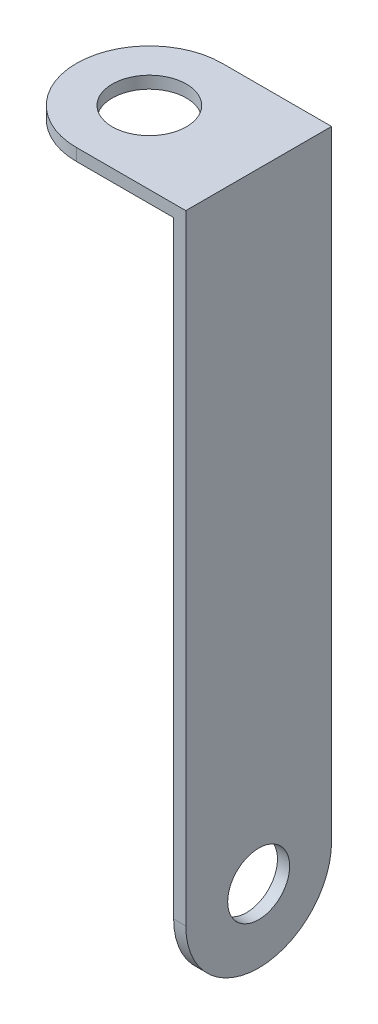
ISO-10303-21;
HEADER;
FILE_DESCRIPTION(('STEP AP214'),'2;1');
FILE_NAME('part.step','',(''),(''),'','','');
FILE_SCHEMA(('AUTOMOTIVE_DESIGN { 1 0 10303 214 1 1 1 1 }'));
ENDSEC;
DATA;
#1=APPLICATION_CONTEXT('core data for automotive mechanical design processes');
#2=APPLICATION_PROTOCOL_DEFINITION('international standard','automotive_design',2000,#1);
#3=PRODUCT_CONTEXT('',#1,'mechanical');
#4=PRODUCT('Part','Part','',(#3));
#5=PRODUCT_RELATED_PRODUCT_CATEGORY('part','',(#4));
#6=PRODUCT_DEFINITION_FORMATION('','',#4);
#7=PRODUCT_DEFINITION_CONTEXT('part definition',#1,'design');
#8=PRODUCT_DEFINITION('design','',#6,#7);
#9=PRODUCT_DEFINITION_SHAPE('','',#8);
#10=(LENGTH_UNIT() NAMED_UNIT(*) SI_UNIT(.MILLI.,.METRE.));
#11=(NAMED_UNIT(*) PLANE_ANGLE_UNIT() SI_UNIT($,.RADIAN.));
#12=(NAMED_UNIT(*) SI_UNIT($,.STERADIAN.) SOLID_ANGLE_UNIT());
#13=UNCERTAINTY_MEASURE_WITH_UNIT(LENGTH_MEASURE(1.E-05),#10,'distance_accuracy_value','');
#14=(GEOMETRIC_REPRESENTATION_CONTEXT(3) GLOBAL_UNCERTAINTY_ASSIGNED_CONTEXT((#13)) GLOBAL_UNIT_ASSIGNED_CONTEXT((#10,
#11,#12)) REPRESENTATION_CONTEXT('',''));
#15=CARTESIAN_POINT('',(0.,0.,0.));
#16=DIRECTION('',(0.,0.,1.));
#17=DIRECTION('',(1.,0.,0.));
#18=AXIS2_PLACEMENT_3D('',#15,#16,#17);
#19=CARTESIAN_POINT('',(0.,1.,0.));
#20=DIRECTION('',(0.,1.,0.));
#21=DIRECTION('',(0.,0.,1.));
#22=AXIS2_PLACEMENT_3D('',#19,#20,#21);
#23=PLANE('',#22);
#24=CARTESIAN_POINT('',(0.,1.,0.));
#25=DIRECTION('',(0.,1.,0.));
#26=DIRECTION('',(0.,0.,1.));
#27=AXIS2_PLACEMENT_3D('',#24,#25,#26);
#28=CIRCLE('',#27,6.);
#29=CARTESIAN_POINT('',(0.,1.,-6.));
#30=VERTEX_POINT('',#29);
#31=CARTESIAN_POINT('',(0.,1.,6.));
#32=VERTEX_POINT('',#31);
#33=EDGE_CURVE('E131',#30,#32,#28,.T.);
#34=ORIENTED_EDGE('',*,*,#33,.T.);
#35=DIRECTION('',(1.,0.,0.));
#36=VECTOR('',#35,1.);
#37=CARTESIAN_POINT('',(9.,1.,6.));
#38=LINE('',#37,#36);
#39=CARTESIAN_POINT('',(9.,1.,6.));
#40=VERTEX_POINT('',#39);
#41=EDGE_CURVE('E79',#32,#40,#38,.T.);
#42=ORIENTED_EDGE('',*,*,#41,.T.);
#43=DIRECTION('',(0.,0.,-1.));
#44=VECTOR('',#43,1.);
#45=CARTESIAN_POINT('',(9.,1.,-6.));
#46=LINE('',#45,#44);
#47=CARTESIAN_POINT('',(9.,1.,-6.));
#48=VERTEX_POINT('',#47);
#49=EDGE_CURVE('E134',#40,#48,#46,.T.);
#50=ORIENTED_EDGE('',*,*,#49,.T.);
#51=DIRECTION('',(-1.,0.,0.));
#52=VECTOR('',#51,1.);
#53=CARTESIAN_POINT('',(0.,1.,-6.));
#54=LINE('',#53,#52);
#55=EDGE_CURVE('E57',#48,#30,#54,.T.);
#56=ORIENTED_EDGE('',*,*,#55,.T.);
#57=EDGE_LOOP('',(#34,#42,#50,#56));
#58=FACE_BOUND('',#57,.T.);
#59=CARTESIAN_POINT('',(0.,1.,0.));
#60=DIRECTION('',(0.,1.,0.));
#61=DIRECTION('',(0.,0.,1.));
#62=AXIS2_PLACEMENT_3D('',#59,#60,#61);
#63=CIRCLE('',#62,3.05);
#64=CARTESIAN_POINT('',(0.,1.,3.05));
#65=VERTEX_POINT('',#64);
#66=EDGE_CURVE('E125',#65,#65,#63,.T.);
#67=ORIENTED_EDGE('',*,*,#66,.F.);
#68=EDGE_LOOP('',(#67));
#69=FACE_BOUND('',#68,.T.);
#70=ADVANCED_FACE('F33',(#58,#69),#23,.T.);
#71=CARTESIAN_POINT('',(0.,0.,0.));
#72=DIRECTION('',(0.,1.,0.));
#73=DIRECTION('',(0.,0.,1.));
#74=AXIS2_PLACEMENT_3D('',#71,#72,#73);
#75=PLANE('',#74);
#76=DIRECTION('',(-1.,0.,0.));
#77=VECTOR('',#76,1.);
#78=CARTESIAN_POINT('',(0.,0.,-6.));
#79=LINE('',#78,#77);
#80=CARTESIAN_POINT('',(8.,0.,-6.));
#81=VERTEX_POINT('',#80);
#82=CARTESIAN_POINT('',(0.,0.,-6.));
#83=VERTEX_POINT('',#82);
#84=EDGE_CURVE('E72',#81,#83,#79,.T.);
#85=ORIENTED_EDGE('',*,*,#84,.F.);
#86=DIRECTION('',(0.,0.,1.));
#87=VECTOR('',#86,1.);
#88=CARTESIAN_POINT('',(8.,0.,-6.));
#89=LINE('',#88,#87);
#90=CARTESIAN_POINT('',(8.,0.,6.));
#91=VERTEX_POINT('',#90);
#92=EDGE_CURVE('E109',#81,#91,#89,.T.);
#93=ORIENTED_EDGE('',*,*,#92,.T.);
#94=DIRECTION('',(1.,0.,0.));
#95=VECTOR('',#94,1.);
#96=CARTESIAN_POINT('',(9.,0.,6.));
#97=LINE('',#96,#95);
#98=CARTESIAN_POINT('',(0.,0.,6.));
#99=VERTEX_POINT('',#98);
#100=EDGE_CURVE('E113',#99,#91,#97,.T.);
#101=ORIENTED_EDGE('',*,*,#100,.F.);
#102=CARTESIAN_POINT('',(0.,0.,0.));
#103=DIRECTION('',(0.,1.,0.));
#104=DIRECTION('',(0.,0.,1.));
#105=AXIS2_PLACEMENT_3D('',#102,#103,#104);
#106=CIRCLE('',#105,6.);
#107=EDGE_CURVE('E128',#83,#99,#106,.T.);
#108=ORIENTED_EDGE('',*,*,#107,.F.);
#109=EDGE_LOOP('',(#85,#93,#101,#108));
#110=FACE_BOUND('',#109,.T.);
#111=CARTESIAN_POINT('',(0.,0.,0.));
#112=DIRECTION('',(0.,1.,0.));
#113=DIRECTION('',(0.,0.,1.));
#114=AXIS2_PLACEMENT_3D('',#111,#112,#113);
#115=CIRCLE('',#114,3.05);
#116=CARTESIAN_POINT('',(0.,0.,3.05));
#117=VERTEX_POINT('',#116);
#118=EDGE_CURVE('E123',#117,#117,#115,.T.);
#119=ORIENTED_EDGE('',*,*,#118,.T.);
#120=EDGE_LOOP('',(#119));
#121=FACE_BOUND('',#120,.T.);
#122=ADVANCED_FACE('F155',(#110,#121),#75,.F.);
#123=CARTESIAN_POINT('',(0.,1.,0.));
#124=DIRECTION('',(0.,-1.,0.));
#125=DIRECTION('',(0.,0.,-1.));
#126=AXIS2_PLACEMENT_3D('',#123,#124,#125);
#127=CYLINDRICAL_SURFACE('',#126,6.);
#128=ORIENTED_EDGE('',*,*,#107,.T.);
#129=DIRECTION('',(0.,-1.,0.));
#130=VECTOR('',#129,1.);
#131=CARTESIAN_POINT('',(0.,1.,6.));
#132=LINE('',#131,#130);
#133=EDGE_CURVE('E11',#32,#99,#132,.T.);
#134=ORIENTED_EDGE('',*,*,#133,.F.);
#135=ORIENTED_EDGE('',*,*,#33,.F.);
#136=DIRECTION('',(0.,-1.,0.));
#137=VECTOR('',#136,1.);
#138=CARTESIAN_POINT('',(0.,1.,-6.));
#139=LINE('',#138,#137);
#140=EDGE_CURVE('E137',#30,#83,#139,.T.);
#141=ORIENTED_EDGE('',*,*,#140,.T.);
#142=EDGE_LOOP('',(#128,#134,#135,#141));
#143=FACE_BOUND('',#142,.T.);
#144=ADVANCED_FACE('F35',(#143),#127,.T.);
#145=CARTESIAN_POINT('',(9.,1.,6.));
#146=DIRECTION('',(0.,0.,-1.));
#147=DIRECTION('',(-1.,0.,0.));
#148=AXIS2_PLACEMENT_3D('',#145,#146,#147);
#149=PLANE('',#148);
#150=ORIENTED_EDGE('',*,*,#100,.T.);
#151=DIRECTION('',(0.,-1.,0.));
#152=VECTOR('',#151,1.);
#153=CARTESIAN_POINT('',(8.,0.999999999999999,6.));
#154=LINE('',#153,#152);
#155=CARTESIAN_POINT('',(8.,-50.,5.99999999999999));
#156=VERTEX_POINT('',#155);
#157=EDGE_CURVE('E48',#91,#156,#154,.T.);
#158=ORIENTED_EDGE('',*,*,#157,.T.);
#159=DIRECTION('',(1.,0.,0.));
#160=VECTOR('',#159,1.);
#161=CARTESIAN_POINT('',(8.,-50.,5.99999999999999));
#162=LINE('',#161,#160);
#163=CARTESIAN_POINT('',(9.,-50.,5.99999999999999));
#164=VERTEX_POINT('',#163);
#165=EDGE_CURVE('E104',#156,#164,#162,.T.);
#166=ORIENTED_EDGE('',*,*,#165,.T.);
#167=DIRECTION('',(0.,-1.,0.));
#168=VECTOR('',#167,1.);
#169=CARTESIAN_POINT('',(9.,1.,6.));
#170=LINE('',#169,#168);
#171=EDGE_CURVE('E41',#40,#164,#170,.T.);
#172=ORIENTED_EDGE('',*,*,#171,.F.);
#173=ORIENTED_EDGE('',*,*,#41,.F.);
#174=ORIENTED_EDGE('',*,*,#133,.T.);
#175=EDGE_LOOP('',(#150,#158,#166,#172,#173,#174));
#176=FACE_BOUND('',#175,.T.);
#177=ADVANCED_FACE('F112',(#176),#149,.F.);
#178=CARTESIAN_POINT('',(9.,1.,-6.));
#179=DIRECTION('',(-1.,0.,0.));
#180=DIRECTION('',(0.,0.,1.));
#181=AXIS2_PLACEMENT_3D('',#178,#179,#180);
#182=PLANE('',#181);
#183=ORIENTED_EDGE('',*,*,#171,.T.);
#184=CARTESIAN_POINT('',(9.,-50.,0.));
#185=DIRECTION('',(-1.,0.,0.));
#186=DIRECTION('',(0.,0.,1.));
#187=AXIS2_PLACEMENT_3D('',#184,#185,#186);
#188=CIRCLE('',#187,6.);
#189=CARTESIAN_POINT('',(9.,-50.,-6.00000000000001));
#190=VERTEX_POINT('',#189);
#191=EDGE_CURVE('E107',#190,#164,#188,.T.);
#192=ORIENTED_EDGE('',*,*,#191,.F.);
#193=DIRECTION('',(0.,-1.,0.));
#194=VECTOR('',#193,1.);
#195=CARTESIAN_POINT('',(9.,1.,-6.));
#196=LINE('',#195,#194);
#197=EDGE_CURVE('E143',#48,#190,#196,.T.);
#198=ORIENTED_EDGE('',*,*,#197,.F.);
#199=ORIENTED_EDGE('',*,*,#49,.F.);
#200=EDGE_LOOP('',(#183,#192,#198,#199));
#201=FACE_BOUND('',#200,.T.);
#202=CARTESIAN_POINT('',(9.,-50.,0.));
#203=DIRECTION('',(-1.,0.,0.));
#204=DIRECTION('',(0.,0.,1.));
#205=AXIS2_PLACEMENT_3D('',#202,#203,#204);
#206=CIRCLE('',#205,2.55);
#207=CARTESIAN_POINT('',(9.,-50.,2.55));
#208=VERTEX_POINT('',#207);
#209=EDGE_CURVE('E118',#208,#208,#206,.T.);
#210=ORIENTED_EDGE('',*,*,#209,.T.);
#211=EDGE_LOOP('',(#210));
#212=FACE_BOUND('',#211,.T.);
#213=ADVANCED_FACE('F146',(#201,#212),#182,.F.);
#214=CARTESIAN_POINT('',(0.,1.,-6.));
#215=DIRECTION('',(0.,0.,1.));
#216=DIRECTION('',(1.,0.,0.));
#217=AXIS2_PLACEMENT_3D('',#214,#215,#216);
#218=PLANE('',#217);
#219=ORIENTED_EDGE('',*,*,#197,.T.);
#220=DIRECTION('',(1.,0.,0.));
#221=VECTOR('',#220,1.);
#222=CARTESIAN_POINT('',(8.,-50.,-6.00000000000001));
#223=LINE('',#222,#221);
#224=CARTESIAN_POINT('',(8.,-50.,-6.00000000000001));
#225=VERTEX_POINT('',#224);
#226=EDGE_CURVE('E108',#225,#190,#223,.T.);
#227=ORIENTED_EDGE('',*,*,#226,.F.);
#228=DIRECTION('',(0.,1.,0.));
#229=VECTOR('',#228,1.);
#230=CARTESIAN_POINT('',(8.,1.,-6.));
#231=LINE('',#230,#229);
#232=EDGE_CURVE('E98',#225,#81,#231,.T.);
#233=ORIENTED_EDGE('',*,*,#232,.T.);
#234=ORIENTED_EDGE('',*,*,#84,.T.);
#235=ORIENTED_EDGE('',*,*,#140,.F.);
#236=ORIENTED_EDGE('',*,*,#55,.F.);
#237=EDGE_LOOP('',(#219,#227,#233,#234,#235,#236));
#238=FACE_BOUND('',#237,.T.);
#239=ADVANCED_FACE('F163',(#238),#218,.F.);
#240=CARTESIAN_POINT('',(0.,1.,0.));
#241=DIRECTION('',(0.,-1.,0.));
#242=DIRECTION('',(0.,0.,-1.));
#243=AXIS2_PLACEMENT_3D('',#240,#241,#242);
#244=CYLINDRICAL_SURFACE('',#243,3.05);
#245=ORIENTED_EDGE('',*,*,#66,.T.);
#246=EDGE_LOOP('',(#245));
#247=FACE_BOUND('',#246,.T.);
#248=ORIENTED_EDGE('',*,*,#118,.F.);
#249=EDGE_LOOP('',(#248));
#250=FACE_BOUND('',#249,.T.);
#251=ADVANCED_FACE('F161',(#247,#250),#244,.F.);
#252=CARTESIAN_POINT('',(8.,-50.,0.));
#253=DIRECTION('',(-1.,0.,0.));
#254=DIRECTION('',(0.,0.,1.));
#255=AXIS2_PLACEMENT_3D('',#252,#253,#254);
#256=PLANE('',#255);
#257=ORIENTED_EDGE('',*,*,#157,.F.);
#258=ORIENTED_EDGE('',*,*,#92,.F.);
#259=ORIENTED_EDGE('',*,*,#232,.F.);
#260=CARTESIAN_POINT('',(8.,-50.,0.));
#261=DIRECTION('',(-1.,0.,0.));
#262=DIRECTION('',(0.,0.,1.));
#263=AXIS2_PLACEMENT_3D('',#260,#261,#262);
#264=CIRCLE('',#263,6.);
#265=EDGE_CURVE('E94',#225,#156,#264,.T.);
#266=ORIENTED_EDGE('',*,*,#265,.T.);
#267=EDGE_LOOP('',(#257,#258,#259,#266));
#268=FACE_BOUND('',#267,.T.);
#269=CARTESIAN_POINT('',(8.,-50.,0.));
#270=DIRECTION('',(-1.,0.,0.));
#271=DIRECTION('',(0.,0.,1.));
#272=AXIS2_PLACEMENT_3D('',#269,#270,#271);
#273=CIRCLE('',#272,2.55);
#274=CARTESIAN_POINT('',(8.,-50.,2.55));
#275=VERTEX_POINT('',#274);
#276=EDGE_CURVE('E115',#275,#275,#273,.T.);
#277=ORIENTED_EDGE('',*,*,#276,.F.);
#278=EDGE_LOOP('',(#277));
#279=FACE_BOUND('',#278,.T.);
#280=ADVANCED_FACE('F96',(#268,#279),#256,.T.);
#281=CARTESIAN_POINT('',(8.,-50.,0.));
#282=DIRECTION('',(1.,0.,0.));
#283=DIRECTION('',(0.,0.,-1.));
#284=AXIS2_PLACEMENT_3D('',#281,#282,#283);
#285=CYLINDRICAL_SURFACE('',#284,6.);
#286=ORIENTED_EDGE('',*,*,#191,.T.);
#287=ORIENTED_EDGE('',*,*,#165,.F.);
#288=ORIENTED_EDGE('',*,*,#265,.F.);
#289=ORIENTED_EDGE('',*,*,#226,.T.);
#290=EDGE_LOOP('',(#286,#287,#288,#289));
#291=FACE_BOUND('',#290,.T.);
#292=ADVANCED_FACE('F105',(#291),#285,.T.);
#293=CARTESIAN_POINT('',(8.,-50.,0.));
#294=DIRECTION('',(1.,0.,0.));
#295=DIRECTION('',(0.,0.,-1.));
#296=AXIS2_PLACEMENT_3D('',#293,#294,#295);
#297=CYLINDRICAL_SURFACE('',#296,2.55);
#298=ORIENTED_EDGE('',*,*,#276,.T.);
#299=EDGE_LOOP('',(#298));
#300=FACE_BOUND('',#299,.T.);
#301=ORIENTED_EDGE('',*,*,#209,.F.);
#302=EDGE_LOOP('',(#301));
#303=FACE_BOUND('',#302,.T.);
#304=ADVANCED_FACE('F226',(#300,#303),#297,.F.);
#305=CLOSED_SHELL('',(#70,#122,#144,#177,#213,#239,#251,#280,#292,#304));
#306=MANIFOLD_SOLID_BREP('B2',#305);
#307=ADVANCED_BREP_SHAPE_REPRESENTATION('',(#18,#306),#14);
#308=SHAPE_DEFINITION_REPRESENTATION(#9,#307);
ENDSEC;
END-ISO-10303-21;
